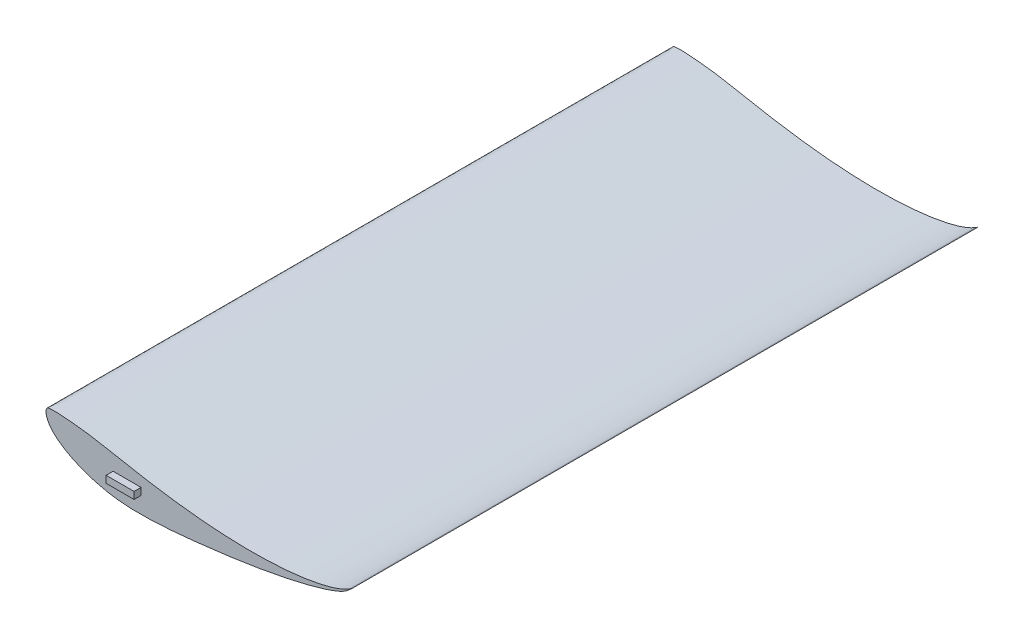
ISO-10303-21;
HEADER;
FILE_DESCRIPTION(('STEP AP214'),'2;1');
FILE_NAME('part.step','',(''),(''),'','','');
FILE_SCHEMA(('AUTOMOTIVE_DESIGN { 1 0 10303 214 1 1 1 1 }'));
ENDSEC;
DATA;
#1=APPLICATION_CONTEXT('core data for automotive mechanical design processes');
#2=APPLICATION_PROTOCOL_DEFINITION('international standard','automotive_design',2000,#1);
#3=PRODUCT_CONTEXT('',#1,'mechanical');
#4=PRODUCT('Part','Part','',(#3));
#5=PRODUCT_RELATED_PRODUCT_CATEGORY('part','',(#4));
#6=PRODUCT_DEFINITION_FORMATION('','',#4);
#7=PRODUCT_DEFINITION_CONTEXT('part definition',#1,'design');
#8=PRODUCT_DEFINITION('design','',#6,#7);
#9=PRODUCT_DEFINITION_SHAPE('','',#8);
#10=(LENGTH_UNIT() NAMED_UNIT(*) SI_UNIT(.MILLI.,.METRE.));
#11=(NAMED_UNIT(*) PLANE_ANGLE_UNIT() SI_UNIT($,.RADIAN.));
#12=(NAMED_UNIT(*) SI_UNIT($,.STERADIAN.) SOLID_ANGLE_UNIT());
#13=UNCERTAINTY_MEASURE_WITH_UNIT(LENGTH_MEASURE(1.E-05),#10,'distance_accuracy_value','');
#14=(GEOMETRIC_REPRESENTATION_CONTEXT(3) GLOBAL_UNCERTAINTY_ASSIGNED_CONTEXT((#13)) GLOBAL_UNIT_ASSIGNED_CONTEXT((#10,
#11,#12)) REPRESENTATION_CONTEXT('',''));
#15=CARTESIAN_POINT('',(0.,0.,0.));
#16=DIRECTION('',(0.,0.,1.));
#17=DIRECTION('',(1.,0.,0.));
#18=AXIS2_PLACEMENT_3D('',#15,#16,#17);
#19=CARTESIAN_POINT('',(1.3066481578843,22.772778671771,-57.929));
#20=DIRECTION('',(0.,0.,-1.));
#21=DIRECTION('',(1.,0.,0.));
#22=AXIS2_PLACEMENT_3D('',#19,#20,#21);
#23=PLANE('',#22);
#24=CARTESIAN_POINT('',(218.553911465575,28.4041286802957,-57.9289999999999));
#25=CARTESIAN_POINT('',(218.434960133351,28.3129988703145,-57.9289999999999));
#26=CARTESIAN_POINT('',(217.991919448388,27.9735809530884,-57.9289999999999));
#27=CARTESIAN_POINT('',(217.142288634638,27.2048983838604,-57.9289999999999));
#28=CARTESIAN_POINT('',(215.906009595726,26.0393785297853,-57.929));
#29=CARTESIAN_POINT('',(214.268722990116,24.6818536252866,-57.929));
#30=CARTESIAN_POINT('',(212.1015631772,23.3540637968846,-57.929));
#31=CARTESIAN_POINT('',(209.383444726749,22.0536033260207,-57.929));
#32=CARTESIAN_POINT('',(206.109916343435,20.7014296762233,-57.929));
#33=CARTESIAN_POINT('',(202.276822966121,19.3098803258843,-57.929));
#34=CARTESIAN_POINT('',(197.905127370969,17.8909758441382,-57.929));
#35=CARTESIAN_POINT('',(193.016520115248,16.456321605092,-57.929));
#36=CARTESIAN_POINT('',(187.638694557866,15.012877819892,-57.929));
#37=CARTESIAN_POINT('',(179.59681085946,13.0303897326272,-57.929));
#38=CARTESIAN_POINT('',(170.990546509162,11.1609810068358,-57.929));
#39=CARTESIAN_POINT('',(161.884743799761,9.37954181343795,-57.9290000000001));
#40=CARTESIAN_POINT('',(154.576928824493,8.05774515568454,-57.9290000000001));
#41=CARTESIAN_POINT('',(147.00787031897,6.78561315085638,-57.9290000000001));
#42=CARTESIAN_POINT('',(136.533653438992,5.16325197412313,-57.9290000000001));
#43=CARTESIAN_POINT('',(125.861696652516,3.69318155809407,-57.9290000000001));
#44=CARTESIAN_POINT('',(112.384557613048,2.04588571430733,-57.9290000000001));
#45=CARTESIAN_POINT('',(99.055237647884,0.585611005280644,-57.9290000000001));
#46=CARTESIAN_POINT('',(85.9329905071319,-0.540959203833753,-57.9290000000001));
#47=CARTESIAN_POINT('',(75.8121477260938,-1.07683015478009,-57.9290000000001));
#48=CARTESIAN_POINT('',(68.6217661940695,-1.24766738635158,-57.9290000000001));
#49=CARTESIAN_POINT('',(61.749367503811,-1.22948287918082,-57.9290000000001));
#50=CARTESIAN_POINT('',(55.207771337394,-0.892990145617868,-57.9290000000001));
#51=CARTESIAN_POINT('',(48.9944436592952,-0.211102779412279,-57.9290000000001));
#52=CARTESIAN_POINT('',(43.0840914025763,0.753096068506244,-57.9290000000001));
#53=CARTESIAN_POINT('',(37.47528809852,2.00220716408669,-57.9290000000001));
#54=CARTESIAN_POINT('',(32.1737959745273,3.4669641655509,-57.9290000000001));
#55=CARTESIAN_POINT('',(27.2020462988095,5.12142398374752,-57.9290000000001));
#56=CARTESIAN_POINT('',(22.5811834642497,6.92689701628644,-57.9290000000001));
#57=CARTESIAN_POINT('',(18.339922053709,8.87371020193491,-57.9290000000001));
#58=CARTESIAN_POINT('',(14.4918635910212,10.922337632436,-57.929));
#59=CARTESIAN_POINT('',(11.0579427785741,13.049482456532,-57.929));
#60=CARTESIAN_POINT('',(8.05969408875818,15.2263200169335,-57.929));
#61=CARTESIAN_POINT('',(5.49835459608894,17.4067096071194,-57.929));
#62=CARTESIAN_POINT('',(3.41106822345844,19.6144518180213,-57.929));
#63=CARTESIAN_POINT('',(1.80776605166581,21.8304275546728,-57.929));
#64=CARTESIAN_POINT('',(0.623447118111804,23.9862768328055,-57.929));
#65=CARTESIAN_POINT('',(-0.13557598390734,26.0331535816458,-57.929));
#66=CARTESIAN_POINT('',(-0.497250528813138,27.9224202016724,-57.9289999999999));
#67=CARTESIAN_POINT('',(-0.427437553627579,29.5202919558224,-57.9289999999999));
#68=CARTESIAN_POINT('',(-0.0160592403181656,30.9857978286067,-57.9289999999999));
#69=CARTESIAN_POINT('',(1.51309982243627,31.7132856799012,-57.9289999999999));
#70=CARTESIAN_POINT('',(3.56907426119414,31.8153499342985,-57.9289999999999));
#71=CARTESIAN_POINT('',(6.38163962817795,31.9142710110509,-57.9289999999999));
#72=CARTESIAN_POINT('',(9.91863907561751,31.7617481678713,-57.9289999999999));
#73=CARTESIAN_POINT('',(14.1400975229462,31.4814576629737,-57.9289999999999));
#74=CARTESIAN_POINT('',(18.9990345441962,31.0324930538691,-57.9289999999999));
#75=CARTESIAN_POINT('',(24.4457297485647,30.4250246341113,-57.9289999999999));
#76=CARTESIAN_POINT('',(30.4536236190558,29.6460172272515,-57.9289999999999));
#77=CARTESIAN_POINT('',(37.019780186568,28.5572384635292,-57.9289999999999));
#78=CARTESIAN_POINT('',(44.1761695041118,27.1919275425756,-57.9289999999999));
#79=CARTESIAN_POINT('',(51.9585687011169,25.7060335780331,-57.929));
#80=CARTESIAN_POINT('',(60.3289380453232,24.1371425789227,-57.929));
#81=CARTESIAN_POINT('',(72.4859753035334,21.9710846633908,-57.929));
#82=CARTESIAN_POINT('',(85.2328363556196,19.9611937705454,-57.929));
#83=CARTESIAN_POINT('',(98.4695074956686,18.2481448842682,-57.929));
#84=CARTESIAN_POINT('',(108.777876010171,17.1273735661006,-57.929));
#85=CARTESIAN_POINT('',(119.211197836787,16.2414500322186,-57.929));
#86=CARTESIAN_POINT('',(133.057928409926,15.4095914464834,-57.929));
#87=CARTESIAN_POINT('',(146.725327939582,15.1326874449194,-57.929));
#88=CARTESIAN_POINT('',(163.024678849486,15.5646572753644,-57.929));
#89=CARTESIAN_POINT('',(175.213061802816,16.4743829797067,-57.929));
#90=CARTESIAN_POINT('',(186.575066781482,18.0050449700351,-57.929));
#91=CARTESIAN_POINT('',(194.056228195329,19.3417292117345,-57.929));
#92=CARTESIAN_POINT('',(200.689909014309,20.8565435155617,-57.929));
#93=CARTESIAN_POINT('',(206.378209307516,22.4885401996357,-57.929));
#94=CARTESIAN_POINT('',(210.983086756775,24.1985055070239,-57.929));
#95=CARTESIAN_POINT('',(214.394607289582,25.8425375385606,-57.929));
#96=CARTESIAN_POINT('',(216.216548835427,26.9377955451639,-57.9289999999999));
#97=CARTESIAN_POINT('',(216.950831465574,27.3792086802957,-57.9289999999999));
#98=B_SPLINE_CURVE_WITH_KNOTS('',3,(#24,#25,#26,#27,#28,#29,#30,#31,#32,#33,#34,#35,#36,#37,#38,
#39,#40,#41,#42,#43,#44,#45,#46,#47,#48,#49,#50,#51,#52,#53,#54,#55,#56,#57,#58,#59,#60,#61,#62,
#63,#64,#65,#66,#67,#68,#69,#70,#71,#72,#73,#74,#75,#76,#77,#78,#79,#80,#81,#82,#83,#84,#85,#86,
#87,#88,#89,#90,#91,#92,#93,#94,#95,#96,#97),.UNSPECIFIED.,.F.,.F.,(4,1,1,1,1,1,1,1,1,1,1,1,1,1,
1,1,1,1,1,1,1,1,1,1,1,1,1,1,1,1,1,1,1,1,1,1,1,1,1,1,1,1,1,1,1,1,1,1,1,1,1,1,1,1,1,1,1,1,1,1,1,1,
1,1,1,1,1,1,1,1,1,4),(0.,0.000983757627704885,0.00366405861177576,0.00751466510265981,
0.0121456504784495,0.0175985797380356,0.024151948624879,0.0319154176650446,0.0408472393431568,
0.0509214943657342,0.0620907463813774,0.0742973940786243,0.0874809949089344,0.116473704200092,
0.132118373975936,0.14840387468989,0.165236223337049,0.182514863638383,0.217999209208015,
0.235968894055118,0.271667316197217,0.306042729852461,0.32243871273602,0.338208761946877,
0.353265176854502,0.367555475744752,0.38119666320742,0.394288247659059,0.406857774780945,
0.418909318112992,0.430388525236769,0.441249010588193,0.45146902438446,0.461014105022589,
0.469856577029753,0.477970652831579,0.48532180928292,0.491914691903657,0.497868125282942,
0.503236552460717,0.508010011631648,0.512170964191511,0.515718218341017,0.518597777068658,
0.521512993703583,0.52600492628947,0.532180979886986,0.539955082862049,0.549245805628723,
0.559959763407088,0.571992783845123,0.58523133298284,0.599734319750154,0.615688564803568,
0.633069213585419,0.65175925258136,0.671607705933678,0.714151547810786,0.736481196672217,
0.759243028423965,0.7822328132371,0.80522931874326,0.850318927147478,0.871954665588305,
0.91227561492752,0.930518030396737,0.947214704222361,0.962159704954208,0.975180318374732,
0.986045181129299,0.99437590018902,1.),.UNSPECIFIED.);
#99=CARTESIAN_POINT('',(218.553911465575,28.4041286802957,-57.9289999999999));
#100=VERTEX_POINT('',#99);
#101=CARTESIAN_POINT('',(216.950831465574,27.3792086802957,-57.9289999999999));
#102=VERTEX_POINT('',#101);
#103=EDGE_CURVE('E193',#100,#102,#98,.T.);
#104=ORIENTED_EDGE('',*,*,#103,.T.);
#105=DIRECTION('',(0.84252214876291,0.53866170166806,0.));
#106=VECTOR('',#105,1.);
#107=CARTESIAN_POINT('',(216.950831465574,27.3792086802957,-57.9289999999999));
#108=LINE('',#107,#106);
#109=EDGE_CURVE('E200',#102,#100,#108,.T.);
#110=ORIENTED_EDGE('',*,*,#109,.T.);
#111=EDGE_LOOP('',(#104,#110));
#112=FACE_BOUND('',#111,.T.);
#113=DIRECTION('',(1.,0.,0.));
#114=VECTOR('',#113,1.);
#115=CARTESIAN_POINT('',(47.5755967177989,15.5685233148763,-57.929));
#116=LINE('',#115,#114);
#117=CARTESIAN_POINT('',(47.5755967177989,15.5685233148763,-57.929));
#118=VERTEX_POINT('',#117);
#119=CARTESIAN_POINT('',(67.5755967177989,15.5685233148763,-57.929));
#120=VERTEX_POINT('',#119);
#121=EDGE_CURVE('E58',#118,#120,#116,.T.);
#122=ORIENTED_EDGE('',*,*,#121,.F.);
#123=DIRECTION('',(0.,1.,0.));
#124=VECTOR('',#123,1.);
#125=CARTESIAN_POINT('',(47.5755967177989,10.5685233148763,-57.929));
#126=LINE('',#125,#124);
#127=CARTESIAN_POINT('',(47.5755967177989,10.5685233148763,-57.929));
#128=VERTEX_POINT('',#127);
#129=EDGE_CURVE('E143',#128,#118,#126,.T.);
#130=ORIENTED_EDGE('',*,*,#129,.F.);
#131=DIRECTION('',(1.,0.,0.));
#132=VECTOR('',#131,1.);
#133=CARTESIAN_POINT('',(47.5755967177989,10.5685233148763,-57.929));
#134=LINE('',#133,#132);
#135=CARTESIAN_POINT('',(67.5755967177989,10.5685233148763,-57.929));
#136=VERTEX_POINT('',#135);
#137=EDGE_CURVE('E140',#128,#136,#134,.T.);
#138=ORIENTED_EDGE('',*,*,#137,.T.);
#139=DIRECTION('',(0.,1.,0.));
#140=VECTOR('',#139,1.);
#141=CARTESIAN_POINT('',(67.5755967177989,10.5685233148763,-57.929));
#142=LINE('',#141,#140);
#143=EDGE_CURVE('E63',#136,#120,#142,.T.);
#144=ORIENTED_EDGE('',*,*,#143,.T.);
#145=EDGE_LOOP('',(#122,#130,#138,#144));
#146=FACE_BOUND('',#145,.T.);
#147=ADVANCED_FACE('F41',(#112,#146),#23,.T.);
#148=DIRECTION('',(0.,0.,1.));
#149=VECTOR('',#148,1.);
#150=SURFACE_OF_LINEAR_EXTRUSION('',#98,#149);
#151=CARTESIAN_POINT('',(218.553911465575,28.4041286802925,390.));
#152=CARTESIAN_POINT('',(218.434960133351,28.3129988703114,390.));
#153=CARTESIAN_POINT('',(217.991919448388,27.9735809530853,390.));
#154=CARTESIAN_POINT('',(217.142288634638,27.2048983838573,390.));
#155=CARTESIAN_POINT('',(215.906009595726,26.0393785297822,390.));
#156=CARTESIAN_POINT('',(214.268722990116,24.6818536252834,390.));
#157=CARTESIAN_POINT('',(212.1015631772,23.3540637968815,390.));
#158=CARTESIAN_POINT('',(209.383444726749,22.0536033260175,390.));
#159=CARTESIAN_POINT('',(206.109916343435,20.7014296762202,390.));
#160=CARTESIAN_POINT('',(202.276822966121,19.3098803258812,390.));
#161=CARTESIAN_POINT('',(197.905127370969,17.8909758441351,390.));
#162=CARTESIAN_POINT('',(193.016520115248,16.4563216050889,390.));
#163=CARTESIAN_POINT('',(187.638694557866,15.0128778198889,390.));
#164=CARTESIAN_POINT('',(179.59681085946,13.0303897326241,390.));
#165=CARTESIAN_POINT('',(170.990546509162,11.1609810068327,390.));
#166=CARTESIAN_POINT('',(161.884743799761,9.37954181343482,390.));
#167=CARTESIAN_POINT('',(154.576928824493,8.05774515568141,390.));
#168=CARTESIAN_POINT('',(147.00787031897,6.78561315085325,390.));
#169=CARTESIAN_POINT('',(136.533653438992,5.16325197412,390.));
#170=CARTESIAN_POINT('',(125.861696652516,3.69318155809094,390.));
#171=CARTESIAN_POINT('',(112.384557613048,2.0458857143042,390.));
#172=CARTESIAN_POINT('',(99.055237647884,0.585611005277514,390.));
#173=CARTESIAN_POINT('',(85.9329905071319,-0.540959203836882,390.));
#174=CARTESIAN_POINT('',(75.8121477260938,-1.07683015478322,390.));
#175=CARTESIAN_POINT('',(68.6217661940695,-1.24766738635471,390.));
#176=CARTESIAN_POINT('',(61.749367503811,-1.22948287918395,390.));
#177=CARTESIAN_POINT('',(55.207771337394,-0.892990145620998,390.));
#178=CARTESIAN_POINT('',(48.9944436592952,-0.211102779415408,390.));
#179=CARTESIAN_POINT('',(43.0840914025763,0.753096068503115,390.));
#180=CARTESIAN_POINT('',(37.47528809852,2.00220716408356,390.));
#181=CARTESIAN_POINT('',(32.1737959745273,3.46696416554777,390.));
#182=CARTESIAN_POINT('',(27.2020462988095,5.12142398374439,390.));
#183=CARTESIAN_POINT('',(22.5811834642497,6.92689701628331,390.));
#184=CARTESIAN_POINT('',(18.339922053709,8.87371020193178,390.));
#185=CARTESIAN_POINT('',(14.4918635910212,10.9223376324329,390.));
#186=CARTESIAN_POINT('',(11.0579427785741,13.0494824565289,390.));
#187=CARTESIAN_POINT('',(8.05969408875818,15.2263200169304,390.));
#188=CARTESIAN_POINT('',(5.49835459608894,17.4067096071163,390.));
#189=CARTESIAN_POINT('',(3.41106822345844,19.6144518180182,390.));
#190=CARTESIAN_POINT('',(1.80776605166581,21.8304275546697,390.));
#191=CARTESIAN_POINT('',(0.623447118111804,23.9862768328024,390.));
#192=CARTESIAN_POINT('',(-0.13557598390734,26.0331535816427,390.));
#193=CARTESIAN_POINT('',(-0.497250528813138,27.9224202016692,390.));
#194=CARTESIAN_POINT('',(-0.427437553627579,29.5202919558192,390.));
#195=CARTESIAN_POINT('',(-0.0160592403181656,30.9857978286036,390.));
#196=CARTESIAN_POINT('',(1.51309982243627,31.713285679898,390.));
#197=CARTESIAN_POINT('',(3.56907426119414,31.8153499342953,390.));
#198=CARTESIAN_POINT('',(6.38163962817795,31.9142710110478,390.));
#199=CARTESIAN_POINT('',(9.91863907561751,31.7617481678682,390.));
#200=CARTESIAN_POINT('',(14.1400975229462,31.4814576629706,390.));
#201=CARTESIAN_POINT('',(18.9990345441962,31.032493053866,390.));
#202=CARTESIAN_POINT('',(24.4457297485647,30.4250246341082,390.));
#203=CARTESIAN_POINT('',(30.4536236190558,29.6460172272483,390.));
#204=CARTESIAN_POINT('',(37.019780186568,28.5572384635261,390.));
#205=CARTESIAN_POINT('',(44.1761695041118,27.1919275425725,390.));
#206=CARTESIAN_POINT('',(51.9585687011169,25.70603357803,390.));
#207=CARTESIAN_POINT('',(60.3289380453232,24.1371425789195,390.));
#208=CARTESIAN_POINT('',(72.4859753035334,21.9710846633877,390.));
#209=CARTESIAN_POINT('',(85.2328363556196,19.9611937705423,390.));
#210=CARTESIAN_POINT('',(98.4695074956686,18.248144884265,390.));
#211=CARTESIAN_POINT('',(108.777876010171,17.1273735660975,390.));
#212=CARTESIAN_POINT('',(119.211197836787,16.2414500322154,390.));
#213=CARTESIAN_POINT('',(133.057928409926,15.4095914464803,390.));
#214=CARTESIAN_POINT('',(146.725327939582,15.1326874449163,390.));
#215=CARTESIAN_POINT('',(163.024678849486,15.5646572753613,390.));
#216=CARTESIAN_POINT('',(175.213061802816,16.4743829797036,390.));
#217=CARTESIAN_POINT('',(186.575066781482,18.005044970032,390.));
#218=CARTESIAN_POINT('',(194.056228195329,19.3417292117314,390.));
#219=CARTESIAN_POINT('',(200.689909014309,20.8565435155586,390.));
#220=CARTESIAN_POINT('',(206.378209307516,22.4885401996326,390.));
#221=CARTESIAN_POINT('',(210.983086756775,24.1985055070208,390.));
#222=CARTESIAN_POINT('',(214.394607289582,25.8425375385575,390.));
#223=CARTESIAN_POINT('',(216.216548835427,26.9377955451608,390.));
#224=CARTESIAN_POINT('',(216.950831465574,27.3792086802925,390.));
#225=B_SPLINE_CURVE_WITH_KNOTS('',3,(#151,#152,#153,#154,#155,#156,#157,#158,#159,#160,#161,
#162,#163,#164,#165,#166,#167,#168,#169,#170,#171,#172,#173,#174,#175,#176,#177,#178,#179,#180,
#181,#182,#183,#184,#185,#186,#187,#188,#189,#190,#191,#192,#193,#194,#195,#196,#197,#198,#199,
#200,#201,#202,#203,#204,#205,#206,#207,#208,#209,#210,#211,#212,#213,#214,#215,#216,#217,#218,
#219,#220,#221,#222,#223,#224),.UNSPECIFIED.,.F.,.F.,(4,1,1,1,1,1,1,1,1,1,1,1,1,1,1,1,1,1,1,1,1,
1,1,1,1,1,1,1,1,1,1,1,1,1,1,1,1,1,1,1,1,1,1,1,1,1,1,1,1,1,1,1,1,1,1,1,1,1,1,1,1,1,1,1,1,1,1,1,1,
1,1,4),(0.,0.000983757627704885,0.00366405861177576,0.00751466510265981,0.0121456504784495,
0.0175985797380356,0.024151948624879,0.0319154176650446,0.0408472393431568,0.0509214943657342,
0.0620907463813774,0.0742973940786243,0.0874809949089344,0.116473704200092,0.132118373975936,
0.14840387468989,0.165236223337049,0.182514863638383,0.217999209208015,0.235968894055118,
0.271667316197217,0.306042729852461,0.32243871273602,0.338208761946877,0.353265176854502,
0.367555475744752,0.38119666320742,0.394288247659059,0.406857774780945,0.418909318112992,
0.430388525236769,0.441249010588193,0.45146902438446,0.461014105022589,0.469856577029753,
0.477970652831579,0.48532180928292,0.491914691903657,0.497868125282942,0.503236552460717,
0.508010011631648,0.512170964191511,0.515718218341017,0.518597777068658,0.521512993703583,
0.52600492628947,0.532180979886986,0.539955082862049,0.549245805628723,0.559959763407088,
0.571992783845123,0.58523133298284,0.599734319750154,0.615688564803568,0.633069213585419,
0.65175925258136,0.671607705933678,0.714151547810786,0.736481196672217,0.759243028423965,
0.7822328132371,0.80522931874326,0.850318927147478,0.871954665588305,0.91227561492752,
0.930518030396737,0.947214704222361,0.962159704954208,0.975180318374732,0.986045181129299,
0.99437590018902,1.),.UNSPECIFIED.);
#226=CARTESIAN_POINT('',(218.553911465575,28.4041286802925,390.));
#227=VERTEX_POINT('',#226);
#228=CARTESIAN_POINT('',(216.950831465574,27.3792086802925,390.));
#229=VERTEX_POINT('',#228);
#230=EDGE_CURVE('E183',#227,#229,#225,.T.);
#231=ORIENTED_EDGE('',*,*,#230,.T.);
#232=DIRECTION('',(0.,0.,1.));
#233=VECTOR('',#232,1.);
#234=CARTESIAN_POINT('',(216.950831465574,27.3792086802957,-57.9289999999999));
#235=LINE('',#234,#233);
#236=EDGE_CURVE('E11',#102,#229,#235,.T.);
#237=ORIENTED_EDGE('',*,*,#236,.F.);
#238=ORIENTED_EDGE('',*,*,#103,.F.);
#239=DIRECTION('',(0.,0.,1.));
#240=VECTOR('',#239,1.);
#241=CARTESIAN_POINT('',(218.553911465575,28.4041286802957,-57.9289999999999));
#242=LINE('',#241,#240);
#243=EDGE_CURVE('E51',#100,#227,#242,.T.);
#244=ORIENTED_EDGE('',*,*,#243,.T.);
#245=EDGE_LOOP('',(#231,#237,#238,#244));
#246=FACE_BOUND('',#245,.T.);
#247=ADVANCED_FACE('F43',(#246),#150,.F.);
#248=CARTESIAN_POINT('',(216.950831465574,27.3792086802957,-57.9289999999999));
#249=DIRECTION('',(0.53866170166806,-0.84252214876291,0.));
#250=DIRECTION('',(-0.84252214876291,-0.53866170166806,0.));
#251=AXIS2_PLACEMENT_3D('',#248,#249,#250);
#252=PLANE('',#251);
#253=DIRECTION('',(0.84252214876291,0.53866170166806,0.));
#254=VECTOR('',#253,1.);
#255=CARTESIAN_POINT('',(216.950831465574,27.3792086802925,390.));
#256=LINE('',#255,#254);
#257=EDGE_CURVE('E201',#229,#227,#256,.T.);
#258=ORIENTED_EDGE('',*,*,#257,.T.);
#259=ORIENTED_EDGE('',*,*,#243,.F.);
#260=ORIENTED_EDGE('',*,*,#109,.F.);
#261=ORIENTED_EDGE('',*,*,#236,.T.);
#262=EDGE_LOOP('',(#258,#259,#260,#261));
#263=FACE_BOUND('',#262,.T.);
#264=ADVANCED_FACE('F226',(#263),#252,.F.);
#265=CARTESIAN_POINT('',(1.3066481578843,22.7727786717679,390.));
#266=DIRECTION('',(0.,0.,-1.));
#267=DIRECTION('',(1.,0.,0.));
#268=AXIS2_PLACEMENT_3D('',#265,#266,#267);
#269=PLANE('',#268);
#270=DIRECTION('',(1.,0.,0.));
#271=VECTOR('',#270,1.);
#272=CARTESIAN_POINT('',(47.5755967177989,10.5685233148732,390.));
#273=LINE('',#272,#271);
#274=CARTESIAN_POINT('',(47.5755967177989,10.5685233148732,390.));
#275=VERTEX_POINT('',#274);
#276=CARTESIAN_POINT('',(67.5755967177989,10.5685233148732,390.));
#277=VERTEX_POINT('',#276);
#278=EDGE_CURVE('E161',#275,#277,#273,.T.);
#279=ORIENTED_EDGE('',*,*,#278,.F.);
#280=DIRECTION('',(0.,1.,0.));
#281=VECTOR('',#280,1.);
#282=CARTESIAN_POINT('',(47.5755967177989,10.5685233148732,390.));
#283=LINE('',#282,#281);
#284=CARTESIAN_POINT('',(47.5755967177989,15.5685233148732,390.));
#285=VERTEX_POINT('',#284);
#286=EDGE_CURVE('E145',#275,#285,#283,.T.);
#287=ORIENTED_EDGE('',*,*,#286,.T.);
#288=DIRECTION('',(1.,0.,0.));
#289=VECTOR('',#288,1.);
#290=CARTESIAN_POINT('',(47.5755967177989,15.5685233148732,390.));
#291=LINE('',#290,#289);
#292=CARTESIAN_POINT('',(67.5755967177989,15.5685233148732,390.));
#293=VERTEX_POINT('',#292);
#294=EDGE_CURVE('E150',#285,#293,#291,.T.);
#295=ORIENTED_EDGE('',*,*,#294,.T.);
#296=DIRECTION('',(0.,1.,0.));
#297=VECTOR('',#296,1.);
#298=CARTESIAN_POINT('',(67.5755967177989,10.5685233148732,390.));
#299=LINE('',#298,#297);
#300=EDGE_CURVE('E175',#277,#293,#299,.T.);
#301=ORIENTED_EDGE('',*,*,#300,.F.);
#302=EDGE_LOOP('',(#279,#287,#295,#301));
#303=FACE_BOUND('',#302,.T.);
#304=ORIENTED_EDGE('',*,*,#230,.F.);
#305=ORIENTED_EDGE('',*,*,#257,.F.);
#306=EDGE_LOOP('',(#304,#305));
#307=FACE_BOUND('',#306,.T.);
#308=ADVANCED_FACE('F225',(#303,#307),#269,.F.);
#309=CARTESIAN_POINT('',(47.5755967177989,10.5685233148732,395.));
#310=DIRECTION('',(-1.,0.,0.));
#311=DIRECTION('',(0.,0.,1.));
#312=AXIS2_PLACEMENT_3D('',#309,#310,#311);
#313=PLANE('',#312);
#314=ORIENTED_EDGE('',*,*,#286,.F.);
#315=DIRECTION('',(0.,0.,-1.));
#316=VECTOR('',#315,1.);
#317=CARTESIAN_POINT('',(47.5755967177989,10.5685233148732,395.));
#318=LINE('',#317,#316);
#319=CARTESIAN_POINT('',(47.5755967177989,10.5685233148732,395.));
#320=VERTEX_POINT('',#319);
#321=EDGE_CURVE('E180',#320,#275,#318,.T.);
#322=ORIENTED_EDGE('',*,*,#321,.F.);
#323=DIRECTION('',(0.,1.,0.));
#324=VECTOR('',#323,1.);
#325=CARTESIAN_POINT('',(47.5755967177989,10.5685233148732,395.));
#326=LINE('',#325,#324);
#327=CARTESIAN_POINT('',(47.5755967177989,15.5685233148732,395.));
#328=VERTEX_POINT('',#327);
#329=EDGE_CURVE('E156',#320,#328,#326,.T.);
#330=ORIENTED_EDGE('',*,*,#329,.T.);
#331=DIRECTION('',(0.,0.,-1.));
#332=VECTOR('',#331,1.);
#333=CARTESIAN_POINT('',(47.5755967177989,15.5685233148732,395.));
#334=LINE('',#333,#332);
#335=EDGE_CURVE('E170',#328,#285,#334,.T.);
#336=ORIENTED_EDGE('',*,*,#335,.T.);
#337=EDGE_LOOP('',(#314,#322,#330,#336));
#338=FACE_BOUND('',#337,.T.);
#339=ADVANCED_FACE('F235',(#338),#313,.T.);
#340=CARTESIAN_POINT('',(47.5755967177989,10.5685233148732,395.));
#341=DIRECTION('',(0.,1.,0.));
#342=DIRECTION('',(0.,0.,1.));
#343=AXIS2_PLACEMENT_3D('',#340,#341,#342);
#344=PLANE('',#343);
#345=ORIENTED_EDGE('',*,*,#278,.T.);
#346=DIRECTION('',(0.,0.,-1.));
#347=VECTOR('',#346,1.);
#348=CARTESIAN_POINT('',(67.5755967177989,10.5685233148732,395.));
#349=LINE('',#348,#347);
#350=CARTESIAN_POINT('',(67.5755967177989,10.5685233148732,395.));
#351=VERTEX_POINT('',#350);
#352=EDGE_CURVE('E184',#351,#277,#349,.T.);
#353=ORIENTED_EDGE('',*,*,#352,.F.);
#354=DIRECTION('',(1.,0.,0.));
#355=VECTOR('',#354,1.);
#356=CARTESIAN_POINT('',(47.5755967177989,10.5685233148732,395.));
#357=LINE('',#356,#355);
#358=EDGE_CURVE('E168',#320,#351,#357,.T.);
#359=ORIENTED_EDGE('',*,*,#358,.F.);
#360=ORIENTED_EDGE('',*,*,#321,.T.);
#361=EDGE_LOOP('',(#345,#353,#359,#360));
#362=FACE_BOUND('',#361,.T.);
#363=ADVANCED_FACE('F256',(#362),#344,.F.);
#364=CARTESIAN_POINT('',(67.5755967177989,10.5685233148732,395.));
#365=DIRECTION('',(-1.,0.,0.));
#366=DIRECTION('',(0.,0.,1.));
#367=AXIS2_PLACEMENT_3D('',#364,#365,#366);
#368=PLANE('',#367);
#369=ORIENTED_EDGE('',*,*,#300,.T.);
#370=DIRECTION('',(0.,0.,-1.));
#371=VECTOR('',#370,1.);
#372=CARTESIAN_POINT('',(67.5755967177989,15.5685233148732,395.));
#373=LINE('',#372,#371);
#374=CARTESIAN_POINT('',(67.5755967177989,15.5685233148732,395.));
#375=VERTEX_POINT('',#374);
#376=EDGE_CURVE('E188',#375,#293,#373,.T.);
#377=ORIENTED_EDGE('',*,*,#376,.F.);
#378=DIRECTION('',(0.,1.,0.));
#379=VECTOR('',#378,1.);
#380=CARTESIAN_POINT('',(67.5755967177989,10.5685233148732,395.));
#381=LINE('',#380,#379);
#382=EDGE_CURVE('E165',#351,#375,#381,.T.);
#383=ORIENTED_EDGE('',*,*,#382,.F.);
#384=ORIENTED_EDGE('',*,*,#352,.T.);
#385=EDGE_LOOP('',(#369,#377,#383,#384));
#386=FACE_BOUND('',#385,.T.);
#387=ADVANCED_FACE('F263',(#386),#368,.F.);
#388=CARTESIAN_POINT('',(47.5755967177989,15.5685233148732,395.));
#389=DIRECTION('',(0.,1.,0.));
#390=DIRECTION('',(0.,0.,1.));
#391=AXIS2_PLACEMENT_3D('',#388,#389,#390);
#392=PLANE('',#391);
#393=ORIENTED_EDGE('',*,*,#294,.F.);
#394=ORIENTED_EDGE('',*,*,#335,.F.);
#395=DIRECTION('',(1.,0.,0.));
#396=VECTOR('',#395,1.);
#397=CARTESIAN_POINT('',(47.5755967177989,15.5685233148732,395.));
#398=LINE('',#397,#396);
#399=EDGE_CURVE('E160',#328,#375,#398,.T.);
#400=ORIENTED_EDGE('',*,*,#399,.T.);
#401=ORIENTED_EDGE('',*,*,#376,.T.);
#402=EDGE_LOOP('',(#393,#394,#400,#401));
#403=FACE_BOUND('',#402,.T.);
#404=ADVANCED_FACE('F271',(#403),#392,.T.);
#405=CARTESIAN_POINT('',(0.,0.,395.));
#406=DIRECTION('',(0.,0.,-1.));
#407=DIRECTION('',(-1.,0.,0.));
#408=AXIS2_PLACEMENT_3D('',#405,#406,#407);
#409=PLANE('',#408);
#410=ORIENTED_EDGE('',*,*,#329,.F.);
#411=ORIENTED_EDGE('',*,*,#358,.T.);
#412=ORIENTED_EDGE('',*,*,#382,.T.);
#413=ORIENTED_EDGE('',*,*,#399,.F.);
#414=EDGE_LOOP('',(#410,#411,#412,#413));
#415=FACE_BOUND('',#414,.T.);
#416=ADVANCED_FACE('F279',(#415),#409,.F.);
#417=CARTESIAN_POINT('',(47.5755967177989,10.5685233148763,-62.929));
#418=DIRECTION('',(1.,0.,0.));
#419=DIRECTION('',(0.,0.,-1.));
#420=AXIS2_PLACEMENT_3D('',#417,#418,#419);
#421=PLANE('',#420);
#422=ORIENTED_EDGE('',*,*,#129,.T.);
#423=DIRECTION('',(0.,0.,1.));
#424=VECTOR('',#423,1.);
#425=CARTESIAN_POINT('',(47.5755967177989,15.5685233148763,-62.929));
#426=LINE('',#425,#424);
#427=CARTESIAN_POINT('',(47.5755967177989,15.5685233148763,-62.929));
#428=VERTEX_POINT('',#427);
#429=EDGE_CURVE('E122',#428,#118,#426,.T.);
#430=ORIENTED_EDGE('',*,*,#429,.F.);
#431=DIRECTION('',(0.,1.,0.));
#432=VECTOR('',#431,1.);
#433=CARTESIAN_POINT('',(47.5755967177989,10.5685233148763,-62.929));
#434=LINE('',#433,#432);
#435=CARTESIAN_POINT('',(47.5755967177989,10.5685233148763,-62.929));
#436=VERTEX_POINT('',#435);
#437=EDGE_CURVE('E130',#436,#428,#434,.T.);
#438=ORIENTED_EDGE('',*,*,#437,.F.);
#439=DIRECTION('',(0.,0.,1.));
#440=VECTOR('',#439,1.);
#441=CARTESIAN_POINT('',(47.5755967177989,10.5685233148763,-62.929));
#442=LINE('',#441,#440);
#443=EDGE_CURVE('E381',#436,#128,#442,.T.);
#444=ORIENTED_EDGE('',*,*,#443,.T.);
#445=EDGE_LOOP('',(#422,#430,#438,#444));
#446=FACE_BOUND('',#445,.T.);
#447=ADVANCED_FACE('F142',(#446),#421,.F.);
#448=CARTESIAN_POINT('',(47.5755967177989,15.5685233148763,-62.929));
#449=DIRECTION('',(0.,-1.,0.));
#450=DIRECTION('',(0.,0.,-1.));
#451=AXIS2_PLACEMENT_3D('',#448,#449,#450);
#452=PLANE('',#451);
#453=ORIENTED_EDGE('',*,*,#121,.T.);
#454=DIRECTION('',(0.,0.,1.));
#455=VECTOR('',#454,1.);
#456=CARTESIAN_POINT('',(67.5755967177989,15.5685233148763,-62.929));
#457=LINE('',#456,#455);
#458=CARTESIAN_POINT('',(67.5755967177989,15.5685233148763,-62.929));
#459=VERTEX_POINT('',#458);
#460=EDGE_CURVE('E124',#459,#120,#457,.T.);
#461=ORIENTED_EDGE('',*,*,#460,.F.);
#462=DIRECTION('',(1.,0.,0.));
#463=VECTOR('',#462,1.);
#464=CARTESIAN_POINT('',(47.5755967177989,15.5685233148763,-62.929));
#465=LINE('',#464,#463);
#466=EDGE_CURVE('E118',#428,#459,#465,.T.);
#467=ORIENTED_EDGE('',*,*,#466,.F.);
#468=ORIENTED_EDGE('',*,*,#429,.T.);
#469=EDGE_LOOP('',(#453,#461,#467,#468));
#470=FACE_BOUND('',#469,.T.);
#471=ADVANCED_FACE('F120',(#470),#452,.F.);
#472=CARTESIAN_POINT('',(67.5755967177989,10.5685233148763,-62.929));
#473=DIRECTION('',(1.,0.,0.));
#474=DIRECTION('',(0.,0.,-1.));
#475=AXIS2_PLACEMENT_3D('',#472,#473,#474);
#476=PLANE('',#475);
#477=ORIENTED_EDGE('',*,*,#143,.F.);
#478=DIRECTION('',(0.,0.,1.));
#479=VECTOR('',#478,1.);
#480=CARTESIAN_POINT('',(67.5755967177989,10.5685233148763,-62.929));
#481=LINE('',#480,#479);
#482=CARTESIAN_POINT('',(67.5755967177989,10.5685233148763,-62.929));
#483=VERTEX_POINT('',#482);
#484=EDGE_CURVE('E152',#483,#136,#481,.T.);
#485=ORIENTED_EDGE('',*,*,#484,.F.);
#486=DIRECTION('',(0.,1.,0.));
#487=VECTOR('',#486,1.);
#488=CARTESIAN_POINT('',(67.5755967177989,10.5685233148763,-62.929));
#489=LINE('',#488,#487);
#490=EDGE_CURVE('E129',#483,#459,#489,.T.);
#491=ORIENTED_EDGE('',*,*,#490,.T.);
#492=ORIENTED_EDGE('',*,*,#460,.T.);
#493=EDGE_LOOP('',(#477,#485,#491,#492));
#494=FACE_BOUND('',#493,.T.);
#495=ADVANCED_FACE('F299',(#494),#476,.T.);
#496=CARTESIAN_POINT('',(47.5755967177989,10.5685233148763,-62.929));
#497=DIRECTION('',(0.,-1.,0.));
#498=DIRECTION('',(0.,0.,-1.));
#499=AXIS2_PLACEMENT_3D('',#496,#497,#498);
#500=PLANE('',#499);
#501=ORIENTED_EDGE('',*,*,#137,.F.);
#502=ORIENTED_EDGE('',*,*,#443,.F.);
#503=DIRECTION('',(1.,0.,0.));
#504=VECTOR('',#503,1.);
#505=CARTESIAN_POINT('',(47.5755967177989,10.5685233148763,-62.929));
#506=LINE('',#505,#504);
#507=EDGE_CURVE('E136',#436,#483,#506,.T.);
#508=ORIENTED_EDGE('',*,*,#507,.T.);
#509=ORIENTED_EDGE('',*,*,#484,.T.);
#510=EDGE_LOOP('',(#501,#502,#508,#509));
#511=FACE_BOUND('',#510,.T.);
#512=ADVANCED_FACE('F307',(#511),#500,.T.);
#513=CARTESIAN_POINT('',(0.,4.36877998347874E-13,-62.9290000000001));
#514=DIRECTION('',(0.,0.,-1.));
#515=DIRECTION('',(0.,1.,0.));
#516=AXIS2_PLACEMENT_3D('',#513,#514,#515);
#517=PLANE('',#516);
#518=ORIENTED_EDGE('',*,*,#437,.T.);
#519=ORIENTED_EDGE('',*,*,#466,.T.);
#520=ORIENTED_EDGE('',*,*,#490,.F.);
#521=ORIENTED_EDGE('',*,*,#507,.F.);
#522=EDGE_LOOP('',(#518,#519,#520,#521));
#523=FACE_BOUND('',#522,.T.);
#524=ADVANCED_FACE('F134',(#523),#517,.T.);
#525=CLOSED_SHELL('',(#147,#247,#264,#308,#339,#363,#387,#404,#416,#447,#471,#495,#512,#524));
#526=MANIFOLD_SOLID_BREP('B2',#525);
#527=ADVANCED_BREP_SHAPE_REPRESENTATION('',(#18,#526),#14);
#528=SHAPE_DEFINITION_REPRESENTATION(#9,#527);
ENDSEC;
END-ISO-10303-21;
